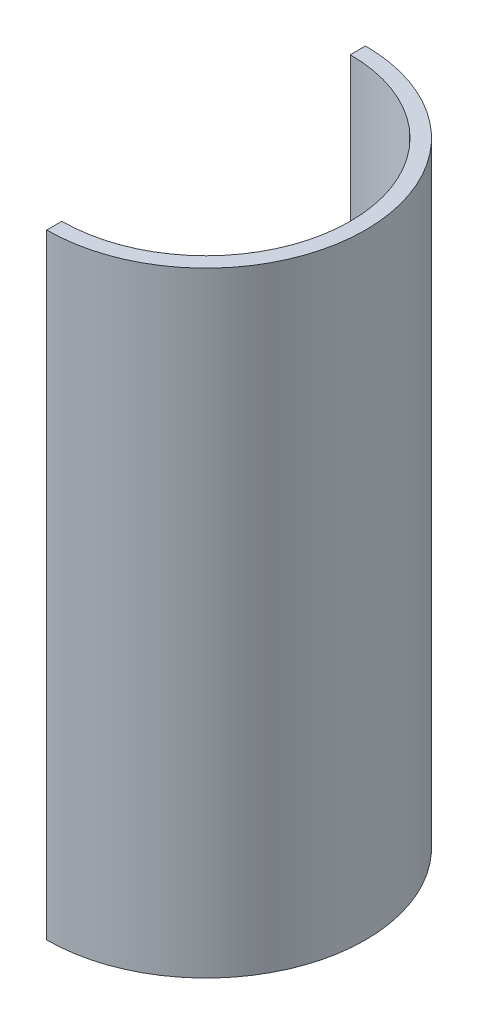
ISO-10303-21;
HEADER;
FILE_DESCRIPTION(('STEP AP214'),'2;1');
FILE_NAME('part.step','',(''),(''),'','','');
FILE_SCHEMA(('AUTOMOTIVE_DESIGN { 1 0 10303 214 1 1 1 1 }'));
ENDSEC;
DATA;
#1=APPLICATION_CONTEXT('core data for automotive mechanical design processes');
#2=APPLICATION_PROTOCOL_DEFINITION('international standard','automotive_design',2000,#1);
#3=PRODUCT_CONTEXT('',#1,'mechanical');
#4=PRODUCT('Part','Part','',(#3));
#5=PRODUCT_RELATED_PRODUCT_CATEGORY('part','',(#4));
#6=PRODUCT_DEFINITION_FORMATION('','',#4);
#7=PRODUCT_DEFINITION_CONTEXT('part definition',#1,'design');
#8=PRODUCT_DEFINITION('design','',#6,#7);
#9=PRODUCT_DEFINITION_SHAPE('','',#8);
#10=(LENGTH_UNIT() NAMED_UNIT(*) SI_UNIT(.MILLI.,.METRE.));
#11=(NAMED_UNIT(*) PLANE_ANGLE_UNIT() SI_UNIT($,.RADIAN.));
#12=(NAMED_UNIT(*) SI_UNIT($,.STERADIAN.) SOLID_ANGLE_UNIT());
#13=UNCERTAINTY_MEASURE_WITH_UNIT(LENGTH_MEASURE(1.E-05),#10,'distance_accuracy_value','');
#14=(GEOMETRIC_REPRESENTATION_CONTEXT(3) GLOBAL_UNCERTAINTY_ASSIGNED_CONTEXT((#13)) GLOBAL_UNIT_ASSIGNED_CONTEXT((#10,
#11,#12)) REPRESENTATION_CONTEXT('',''));
#15=CARTESIAN_POINT('',(0.,0.,0.));
#16=DIRECTION('',(0.,0.,1.));
#17=DIRECTION('',(1.,0.,0.));
#18=AXIS2_PLACEMENT_3D('',#15,#16,#17);
#19=CARTESIAN_POINT('',(0.,40.5,0.));
#20=DIRECTION('',(0.,-1.,0.));
#21=DIRECTION('',(0.,0.,-1.));
#22=AXIS2_PLACEMENT_3D('',#19,#20,#21);
#23=CYLINDRICAL_SURFACE('',#22,10.5);
#24=CARTESIAN_POINT('',(0.,40.5,0.));
#25=DIRECTION('',(0.,1.,0.));
#26=DIRECTION('',(0.,0.,1.));
#27=AXIS2_PLACEMENT_3D('',#24,#25,#26);
#28=CIRCLE('',#27,10.5);
#29=CARTESIAN_POINT('',(0.,40.5,10.5));
#30=VERTEX_POINT('',#29);
#31=CARTESIAN_POINT('',(0.,40.5,-10.5));
#32=VERTEX_POINT('',#31);
#33=EDGE_CURVE('E40',#30,#32,#28,.T.);
#34=ORIENTED_EDGE('',*,*,#33,.F.);
#35=DIRECTION('',(0.,-1.,0.));
#36=VECTOR('',#35,1.);
#37=CARTESIAN_POINT('',(0.,40.5,10.5));
#38=LINE('',#37,#36);
#39=CARTESIAN_POINT('',(0.,0.,10.5));
#40=VERTEX_POINT('',#39);
#41=EDGE_CURVE('E90',#30,#40,#38,.T.);
#42=ORIENTED_EDGE('',*,*,#41,.T.);
#43=CARTESIAN_POINT('',(0.,0.,0.));
#44=DIRECTION('',(0.,1.,0.));
#45=DIRECTION('',(0.,0.,1.));
#46=AXIS2_PLACEMENT_3D('',#43,#44,#45);
#47=CIRCLE('',#46,10.5);
#48=CARTESIAN_POINT('',(0.,0.,-10.5));
#49=VERTEX_POINT('',#48);
#50=EDGE_CURVE('E92',#40,#49,#47,.T.);
#51=ORIENTED_EDGE('',*,*,#50,.T.);
#52=DIRECTION('',(0.,-1.,0.));
#53=VECTOR('',#52,1.);
#54=CARTESIAN_POINT('',(0.,40.5,-10.5));
#55=LINE('',#54,#53);
#56=EDGE_CURVE('E55',#49,#32,#55,.F.);
#57=ORIENTED_EDGE('',*,*,#56,.T.);
#58=EDGE_LOOP('',(#34,#42,#51,#57));
#59=FACE_BOUND('',#58,.T.);
#60=ADVANCED_FACE('F33',(#59),#23,.T.);
#61=CARTESIAN_POINT('',(0.,40.5,0.));
#62=DIRECTION('',(0.,1.,0.));
#63=DIRECTION('',(0.,0.,1.));
#64=AXIS2_PLACEMENT_3D('',#61,#62,#63);
#65=PLANE('',#64);
#66=CARTESIAN_POINT('',(0.,40.5,0.));
#67=DIRECTION('',(0.,1.,0.));
#68=DIRECTION('',(0.,0.,1.));
#69=AXIS2_PLACEMENT_3D('',#66,#67,#68);
#70=CIRCLE('',#69,9.5);
#71=CARTESIAN_POINT('',(0.,40.5,9.5));
#72=VERTEX_POINT('',#71);
#73=CARTESIAN_POINT('',(0.,40.5,-9.5));
#74=VERTEX_POINT('',#73);
#75=EDGE_CURVE('E70',#72,#74,#70,.T.);
#76=ORIENTED_EDGE('',*,*,#75,.F.);
#77=DIRECTION('',(0.,0.,-1.));
#78=VECTOR('',#77,1.);
#79=CARTESIAN_POINT('',(0.,40.5,0.));
#80=LINE('',#79,#78);
#81=EDGE_CURVE('E89',#30,#72,#80,.T.);
#82=ORIENTED_EDGE('',*,*,#81,.F.);
#83=ORIENTED_EDGE('',*,*,#33,.T.);
#84=EDGE_CURVE('E84',#74,#32,#80,.T.);
#85=ORIENTED_EDGE('',*,*,#84,.F.);
#86=EDGE_LOOP('',(#76,#82,#83,#85));
#87=FACE_BOUND('',#86,.T.);
#88=ADVANCED_FACE('F87',(#87),#65,.T.);
#89=CARTESIAN_POINT('',(0.,0.,0.));
#90=DIRECTION('',(0.,1.,0.));
#91=DIRECTION('',(0.,0.,1.));
#92=AXIS2_PLACEMENT_3D('',#89,#90,#91);
#93=PLANE('',#92);
#94=ORIENTED_EDGE('',*,*,#50,.F.);
#95=DIRECTION('',(0.,0.,-1.));
#96=VECTOR('',#95,1.);
#97=CARTESIAN_POINT('',(0.,0.,0.));
#98=LINE('',#97,#96);
#99=EDGE_CURVE('E11',#40,#49,#98,.T.);
#100=ORIENTED_EDGE('',*,*,#99,.T.);
#101=EDGE_LOOP('',(#94,#100));
#102=FACE_BOUND('',#101,.T.);
#103=ADVANCED_FACE('F101',(#102),#93,.F.);
#104=CARTESIAN_POINT('',(0.,0.,0.));
#105=DIRECTION('',(1.,0.,0.));
#106=DIRECTION('',(0.,0.,-1.));
#107=AXIS2_PLACEMENT_3D('',#104,#105,#106);
#108=PLANE('',#107);
#109=DIRECTION('',(0.,0.,-1.));
#110=VECTOR('',#109,1.);
#111=CARTESIAN_POINT('',(0.,1.,0.));
#112=LINE('',#111,#110);
#113=CARTESIAN_POINT('',(0.,1.,9.5));
#114=VERTEX_POINT('',#113);
#115=CARTESIAN_POINT('',(0.,1.,-9.5));
#116=VERTEX_POINT('',#115);
#117=EDGE_CURVE('E80',#114,#116,#112,.T.);
#118=ORIENTED_EDGE('',*,*,#117,.T.);
#119=DIRECTION('',(0.,-1.,0.));
#120=VECTOR('',#119,1.);
#121=CARTESIAN_POINT('',(0.,1.,-9.5));
#122=LINE('',#121,#120);
#123=EDGE_CURVE('E73',#116,#74,#122,.F.);
#124=ORIENTED_EDGE('',*,*,#123,.T.);
#125=ORIENTED_EDGE('',*,*,#84,.T.);
#126=ORIENTED_EDGE('',*,*,#56,.F.);
#127=ORIENTED_EDGE('',*,*,#99,.F.);
#128=ORIENTED_EDGE('',*,*,#41,.F.);
#129=ORIENTED_EDGE('',*,*,#81,.T.);
#130=DIRECTION('',(0.,-1.,0.));
#131=VECTOR('',#130,1.);
#132=CARTESIAN_POINT('',(0.,40.5,9.5));
#133=LINE('',#132,#131);
#134=EDGE_CURVE('E75',#72,#114,#133,.T.);
#135=ORIENTED_EDGE('',*,*,#134,.T.);
#136=EDGE_LOOP('',(#118,#124,#125,#126,#127,#128,#129,#135));
#137=FACE_BOUND('',#136,.T.);
#138=ADVANCED_FACE('F83',(#137),#108,.F.);
#139=CARTESIAN_POINT('',(0.,40.5,0.));
#140=DIRECTION('',(0.,-1.,0.));
#141=DIRECTION('',(0.,0.,-1.));
#142=AXIS2_PLACEMENT_3D('',#139,#140,#141);
#143=CYLINDRICAL_SURFACE('',#142,9.5);
#144=ORIENTED_EDGE('',*,*,#75,.T.);
#145=ORIENTED_EDGE('',*,*,#123,.F.);
#146=CARTESIAN_POINT('',(0.,1.,0.));
#147=DIRECTION('',(0.,1.,0.));
#148=DIRECTION('',(0.,0.,1.));
#149=AXIS2_PLACEMENT_3D('',#146,#147,#148);
#150=CIRCLE('',#149,9.5);
#151=EDGE_CURVE('E47',#114,#116,#150,.T.);
#152=ORIENTED_EDGE('',*,*,#151,.F.);
#153=ORIENTED_EDGE('',*,*,#134,.F.);
#154=EDGE_LOOP('',(#144,#145,#152,#153));
#155=FACE_BOUND('',#154,.T.);
#156=ADVANCED_FACE('F72',(#155),#143,.F.);
#157=CARTESIAN_POINT('',(0.,1.,0.));
#158=DIRECTION('',(0.,1.,0.));
#159=DIRECTION('',(0.,0.,1.));
#160=AXIS2_PLACEMENT_3D('',#157,#158,#159);
#161=PLANE('',#160);
#162=ORIENTED_EDGE('',*,*,#151,.T.);
#163=ORIENTED_EDGE('',*,*,#117,.F.);
#164=EDGE_LOOP('',(#162,#163));
#165=FACE_BOUND('',#164,.T.);
#166=ADVANCED_FACE('F106',(#165),#161,.T.);
#167=CLOSED_SHELL('',(#60,#88,#103,#138,#156,#166));
#168=MANIFOLD_SOLID_BREP('B2',#167);
#169=ADVANCED_BREP_SHAPE_REPRESENTATION('',(#18,#168),#14);
#170=SHAPE_DEFINITION_REPRESENTATION(#9,#169);
ENDSEC;
END-ISO-10303-21;
